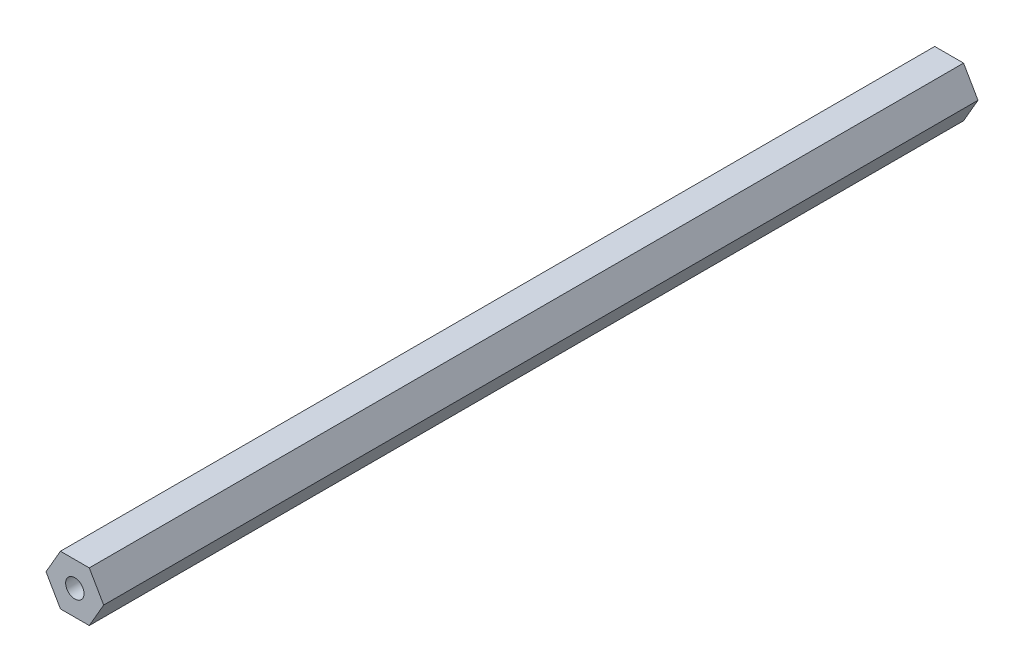
ISO-10303-21;
HEADER;
FILE_DESCRIPTION(('STEP AP214'),'2;1');
FILE_NAME('part.step','',(''),(''),'','','');
FILE_SCHEMA(('AUTOMOTIVE_DESIGN { 1 0 10303 214 1 1 1 1 }'));
ENDSEC;
DATA;
#1=APPLICATION_CONTEXT('core data for automotive mechanical design processes');
#2=APPLICATION_PROTOCOL_DEFINITION('international standard','automotive_design',2000,#1);
#3=PRODUCT_CONTEXT('',#1,'mechanical');
#4=PRODUCT('Part','Part','',(#3));
#5=PRODUCT_RELATED_PRODUCT_CATEGORY('part','',(#4));
#6=PRODUCT_DEFINITION_FORMATION('','',#4);
#7=PRODUCT_DEFINITION_CONTEXT('part definition',#1,'design');
#8=PRODUCT_DEFINITION('design','',#6,#7);
#9=PRODUCT_DEFINITION_SHAPE('','',#8);
#10=(LENGTH_UNIT() NAMED_UNIT(*) SI_UNIT(.MILLI.,.METRE.));
#11=(NAMED_UNIT(*) PLANE_ANGLE_UNIT() SI_UNIT($,.RADIAN.));
#12=(NAMED_UNIT(*) SI_UNIT($,.STERADIAN.) SOLID_ANGLE_UNIT());
#13=UNCERTAINTY_MEASURE_WITH_UNIT(LENGTH_MEASURE(1.E-05),#10,'distance_accuracy_value','');
#14=(GEOMETRIC_REPRESENTATION_CONTEXT(3) GLOBAL_UNCERTAINTY_ASSIGNED_CONTEXT((#13)) GLOBAL_UNIT_ASSIGNED_CONTEXT((#10,
#11,#12)) REPRESENTATION_CONTEXT('',''));
#15=CARTESIAN_POINT('',(0.,0.,0.));
#16=DIRECTION('',(0.,0.,1.));
#17=DIRECTION('',(1.,0.,0.));
#18=AXIS2_PLACEMENT_3D('',#15,#16,#17);
#19=CARTESIAN_POINT('',(4.61880215351701,0.,140.));
#20=DIRECTION('',(-0.866025403784439,-0.5,0.));
#21=DIRECTION('',(0.5,-0.866025403784439,0.));
#22=AXIS2_PLACEMENT_3D('',#19,#20,#21);
#23=PLANE('',#22);
#24=DIRECTION('',(-0.5,0.866025403784439,0.));
#25=VECTOR('',#24,1.);
#26=CARTESIAN_POINT('',(4.61880215351701,0.,0.));
#27=LINE('',#26,#25);
#28=CARTESIAN_POINT('',(4.61880215351701,0.,0.));
#29=VERTEX_POINT('',#28);
#30=CARTESIAN_POINT('',(2.3094010767585,4.,0.));
#31=VERTEX_POINT('',#30);
#32=EDGE_CURVE('E123',#29,#31,#27,.T.);
#33=ORIENTED_EDGE('',*,*,#32,.T.);
#34=DIRECTION('',(0.,0.,-1.));
#35=VECTOR('',#34,1.);
#36=CARTESIAN_POINT('',(2.3094010767585,4.,140.));
#37=LINE('',#36,#35);
#38=CARTESIAN_POINT('',(2.3094010767585,4.,140.));
#39=VERTEX_POINT('',#38);
#40=EDGE_CURVE('E11',#39,#31,#37,.T.);
#41=ORIENTED_EDGE('',*,*,#40,.F.);
#42=DIRECTION('',(-0.5,0.866025403784439,0.));
#43=VECTOR('',#42,1.);
#44=CARTESIAN_POINT('',(4.61880215351701,0.,140.));
#45=LINE('',#44,#43);
#46=CARTESIAN_POINT('',(4.61880215351701,0.,140.));
#47=VERTEX_POINT('',#46);
#48=EDGE_CURVE('E134',#47,#39,#45,.T.);
#49=ORIENTED_EDGE('',*,*,#48,.F.);
#50=DIRECTION('',(0.,0.,-1.));
#51=VECTOR('',#50,1.);
#52=CARTESIAN_POINT('',(4.61880215351701,0.,140.));
#53=LINE('',#52,#51);
#54=EDGE_CURVE('E119',#47,#29,#53,.T.);
#55=ORIENTED_EDGE('',*,*,#54,.T.);
#56=EDGE_LOOP('',(#33,#41,#49,#55));
#57=FACE_BOUND('',#56,.T.);
#58=ADVANCED_FACE('F39',(#57),#23,.F.);
#59=CARTESIAN_POINT('',(2.3094010767585,4.,140.));
#60=DIRECTION('',(0.,-1.,0.));
#61=DIRECTION('',(1.,0.,0.));
#62=AXIS2_PLACEMENT_3D('',#59,#60,#61);
#63=PLANE('',#62);
#64=DIRECTION('',(-1.,0.,0.));
#65=VECTOR('',#64,1.);
#66=CARTESIAN_POINT('',(2.3094010767585,4.,0.));
#67=LINE('',#66,#65);
#68=CARTESIAN_POINT('',(-2.3094010767585,4.,0.));
#69=VERTEX_POINT('',#68);
#70=EDGE_CURVE('E126',#31,#69,#67,.T.);
#71=ORIENTED_EDGE('',*,*,#70,.T.);
#72=DIRECTION('',(0.,0.,-1.));
#73=VECTOR('',#72,1.);
#74=CARTESIAN_POINT('',(-2.3094010767585,4.,140.));
#75=LINE('',#74,#73);
#76=CARTESIAN_POINT('',(-2.3094010767585,4.,140.));
#77=VERTEX_POINT('',#76);
#78=EDGE_CURVE('E47',#77,#69,#75,.T.);
#79=ORIENTED_EDGE('',*,*,#78,.F.);
#80=DIRECTION('',(-1.,0.,0.));
#81=VECTOR('',#80,1.);
#82=CARTESIAN_POINT('',(2.3094010767585,4.,140.));
#83=LINE('',#82,#81);
#84=EDGE_CURVE('E92',#39,#77,#83,.T.);
#85=ORIENTED_EDGE('',*,*,#84,.F.);
#86=ORIENTED_EDGE('',*,*,#40,.T.);
#87=EDGE_LOOP('',(#71,#79,#85,#86));
#88=FACE_BOUND('',#87,.T.);
#89=ADVANCED_FACE('F159',(#88),#63,.F.);
#90=CARTESIAN_POINT('',(-2.3094010767585,4.,140.));
#91=DIRECTION('',(0.866025403784439,-0.5,0.));
#92=DIRECTION('',(0.5,0.866025403784439,0.));
#93=AXIS2_PLACEMENT_3D('',#90,#91,#92);
#94=PLANE('',#93);
#95=DIRECTION('',(-0.5,-0.866025403784439,0.));
#96=VECTOR('',#95,1.);
#97=CARTESIAN_POINT('',(-2.3094010767585,4.,0.));
#98=LINE('',#97,#96);
#99=CARTESIAN_POINT('',(-4.618802153517,0.,0.));
#100=VERTEX_POINT('',#99);
#101=EDGE_CURVE('E129',#69,#100,#98,.T.);
#102=ORIENTED_EDGE('',*,*,#101,.T.);
#103=DIRECTION('',(0.,0.,-1.));
#104=VECTOR('',#103,1.);
#105=CARTESIAN_POINT('',(-4.618802153517,0.,140.));
#106=LINE('',#105,#104);
#107=CARTESIAN_POINT('',(-4.618802153517,0.,140.));
#108=VERTEX_POINT('',#107);
#109=EDGE_CURVE('E114',#108,#100,#106,.T.);
#110=ORIENTED_EDGE('',*,*,#109,.F.);
#111=DIRECTION('',(-0.5,-0.866025403784439,0.));
#112=VECTOR('',#111,1.);
#113=CARTESIAN_POINT('',(-2.3094010767585,4.,140.));
#114=LINE('',#113,#112);
#115=EDGE_CURVE('E105',#77,#108,#114,.T.);
#116=ORIENTED_EDGE('',*,*,#115,.F.);
#117=ORIENTED_EDGE('',*,*,#78,.T.);
#118=EDGE_LOOP('',(#102,#110,#116,#117));
#119=FACE_BOUND('',#118,.T.);
#120=ADVANCED_FACE('F140',(#119),#94,.F.);
#121=CARTESIAN_POINT('',(-4.618802153517,0.,140.));
#122=DIRECTION('',(0.866025403784439,0.5,0.));
#123=DIRECTION('',(-0.5,0.866025403784439,0.));
#124=AXIS2_PLACEMENT_3D('',#121,#122,#123);
#125=PLANE('',#124);
#126=DIRECTION('',(0.5,-0.866025403784439,0.));
#127=VECTOR('',#126,1.);
#128=CARTESIAN_POINT('',(-4.618802153517,0.,0.));
#129=LINE('',#128,#127);
#130=CARTESIAN_POINT('',(-2.3094010767585,-4.,0.));
#131=VERTEX_POINT('',#130);
#132=EDGE_CURVE('E113',#100,#131,#129,.T.);
#133=ORIENTED_EDGE('',*,*,#132,.T.);
#134=DIRECTION('',(0.,0.,-1.));
#135=VECTOR('',#134,1.);
#136=CARTESIAN_POINT('',(-2.3094010767585,-4.,140.));
#137=LINE('',#136,#135);
#138=CARTESIAN_POINT('',(-2.3094010767585,-4.,140.));
#139=VERTEX_POINT('',#138);
#140=EDGE_CURVE('E110',#139,#131,#137,.T.);
#141=ORIENTED_EDGE('',*,*,#140,.F.);
#142=DIRECTION('',(0.5,-0.866025403784439,0.));
#143=VECTOR('',#142,1.);
#144=CARTESIAN_POINT('',(-4.618802153517,0.,140.));
#145=LINE('',#144,#143);
#146=EDGE_CURVE('E99',#108,#139,#145,.T.);
#147=ORIENTED_EDGE('',*,*,#146,.F.);
#148=ORIENTED_EDGE('',*,*,#109,.T.);
#149=EDGE_LOOP('',(#133,#141,#147,#148));
#150=FACE_BOUND('',#149,.T.);
#151=ADVANCED_FACE('F111',(#150),#125,.F.);
#152=CARTESIAN_POINT('',(-2.3094010767585,-4.,140.));
#153=DIRECTION('',(0.,1.,0.));
#154=DIRECTION('',(-1.,0.,0.));
#155=AXIS2_PLACEMENT_3D('',#152,#153,#154);
#156=PLANE('',#155);
#157=DIRECTION('',(1.,0.,0.));
#158=VECTOR('',#157,1.);
#159=CARTESIAN_POINT('',(-2.3094010767585,-4.,0.));
#160=LINE('',#159,#158);
#161=CARTESIAN_POINT('',(2.3094010767585,-4.,0.));
#162=VERTEX_POINT('',#161);
#163=EDGE_CURVE('E78',#131,#162,#160,.T.);
#164=ORIENTED_EDGE('',*,*,#163,.T.);
#165=DIRECTION('',(0.,0.,-1.));
#166=VECTOR('',#165,1.);
#167=CARTESIAN_POINT('',(2.3094010767585,-4.,140.));
#168=LINE('',#167,#166);
#169=CARTESIAN_POINT('',(2.3094010767585,-4.,140.));
#170=VERTEX_POINT('',#169);
#171=EDGE_CURVE('E115',#170,#162,#168,.T.);
#172=ORIENTED_EDGE('',*,*,#171,.F.);
#173=DIRECTION('',(1.,0.,0.));
#174=VECTOR('',#173,1.);
#175=CARTESIAN_POINT('',(-2.3094010767585,-4.,140.));
#176=LINE('',#175,#174);
#177=EDGE_CURVE('E103',#139,#170,#176,.T.);
#178=ORIENTED_EDGE('',*,*,#177,.F.);
#179=ORIENTED_EDGE('',*,*,#140,.T.);
#180=EDGE_LOOP('',(#164,#172,#178,#179));
#181=FACE_BOUND('',#180,.T.);
#182=ADVANCED_FACE('F117',(#181),#156,.F.);
#183=CARTESIAN_POINT('',(2.3094010767585,-4.,140.));
#184=DIRECTION('',(-0.866025403784439,0.5,0.));
#185=DIRECTION('',(-0.5,-0.866025403784439,0.));
#186=AXIS2_PLACEMENT_3D('',#183,#184,#185);
#187=PLANE('',#186);
#188=DIRECTION('',(0.5,0.866025403784439,0.));
#189=VECTOR('',#188,1.);
#190=CARTESIAN_POINT('',(2.3094010767585,-4.,0.));
#191=LINE('',#190,#189);
#192=EDGE_CURVE('E84',#162,#29,#191,.T.);
#193=ORIENTED_EDGE('',*,*,#192,.T.);
#194=ORIENTED_EDGE('',*,*,#54,.F.);
#195=DIRECTION('',(0.5,0.866025403784439,0.));
#196=VECTOR('',#195,1.);
#197=CARTESIAN_POINT('',(2.3094010767585,-4.,140.));
#198=LINE('',#197,#196);
#199=EDGE_CURVE('E55',#170,#47,#198,.T.);
#200=ORIENTED_EDGE('',*,*,#199,.F.);
#201=ORIENTED_EDGE('',*,*,#171,.T.);
#202=EDGE_LOOP('',(#193,#194,#200,#201));
#203=FACE_BOUND('',#202,.T.);
#204=ADVANCED_FACE('F147',(#203),#187,.F.);
#205=CARTESIAN_POINT('',(0.,0.,140.));
#206=DIRECTION('',(0.,0.,1.));
#207=DIRECTION('',(1.,0.,0.));
#208=AXIS2_PLACEMENT_3D('',#205,#206,#207);
#209=PLANE('',#208);
#210=CARTESIAN_POINT('',(0.,0.,140.));
#211=DIRECTION('',(0.,0.,1.));
#212=DIRECTION('',(1.,0.,0.));
#213=AXIS2_PLACEMENT_3D('',#210,#211,#212);
#214=CIRCLE('',#213,1.475);
#215=CARTESIAN_POINT('',(1.475,0.,140.));
#216=VERTEX_POINT('',#215);
#217=EDGE_CURVE('E127',#216,#216,#214,.T.);
#218=ORIENTED_EDGE('',*,*,#217,.F.);
#219=EDGE_LOOP('',(#218));
#220=FACE_BOUND('',#219,.T.);
#221=ORIENTED_EDGE('',*,*,#48,.T.);
#222=ORIENTED_EDGE('',*,*,#84,.T.);
#223=ORIENTED_EDGE('',*,*,#115,.T.);
#224=ORIENTED_EDGE('',*,*,#146,.T.);
#225=ORIENTED_EDGE('',*,*,#177,.T.);
#226=ORIENTED_EDGE('',*,*,#199,.T.);
#227=EDGE_LOOP('',(#221,#222,#223,#224,#225,#226));
#228=FACE_BOUND('',#227,.T.);
#229=ADVANCED_FACE('F101',(#220,#228),#209,.T.);
#230=CARTESIAN_POINT('',(0.,0.,0.));
#231=DIRECTION('',(0.,0.,1.));
#232=DIRECTION('',(1.,0.,0.));
#233=AXIS2_PLACEMENT_3D('',#230,#231,#232);
#234=PLANE('',#233);
#235=CARTESIAN_POINT('',(0.,0.,0.));
#236=DIRECTION('',(0.,0.,-1.));
#237=DIRECTION('',(-1.,0.,0.));
#238=AXIS2_PLACEMENT_3D('',#235,#236,#237);
#239=CIRCLE('',#238,1.475);
#240=CARTESIAN_POINT('',(-1.475,0.,0.));
#241=VERTEX_POINT('',#240);
#242=EDGE_CURVE('E246',#241,#241,#239,.T.);
#243=ORIENTED_EDGE('',*,*,#242,.F.);
#244=EDGE_LOOP('',(#243));
#245=FACE_BOUND('',#244,.T.);
#246=ORIENTED_EDGE('',*,*,#32,.F.);
#247=ORIENTED_EDGE('',*,*,#192,.F.);
#248=ORIENTED_EDGE('',*,*,#163,.F.);
#249=ORIENTED_EDGE('',*,*,#132,.F.);
#250=ORIENTED_EDGE('',*,*,#101,.F.);
#251=ORIENTED_EDGE('',*,*,#70,.F.);
#252=EDGE_LOOP('',(#246,#247,#248,#249,#250,#251));
#253=FACE_BOUND('',#252,.T.);
#254=ADVANCED_FACE('F143',(#245,#253),#234,.F.);
#255=CARTESIAN_POINT('',(0.,0.,220.));
#256=DIRECTION('',(0.,0.,-1.));
#257=DIRECTION('',(-1.,0.,0.));
#258=AXIS2_PLACEMENT_3D('',#255,#256,#257);
#259=CYLINDRICAL_SURFACE('',#258,1.475);
#260=ORIENTED_EDGE('',*,*,#217,.T.);
#261=EDGE_LOOP('',(#260));
#262=FACE_BOUND('',#261,.T.);
#263=ORIENTED_EDGE('',*,*,#242,.T.);
#264=EDGE_LOOP('',(#263));
#265=FACE_BOUND('',#264,.T.);
#266=ADVANCED_FACE('F199',(#262,#265),#259,.F.);
#267=CLOSED_SHELL('',(#58,#89,#120,#151,#182,#204,#229,#254,#266));
#268=MANIFOLD_SOLID_BREP('B2',#267);
#269=ADVANCED_BREP_SHAPE_REPRESENTATION('',(#18,#268),#14);
#270=SHAPE_DEFINITION_REPRESENTATION(#9,#269);
ENDSEC;
END-ISO-10303-21;
